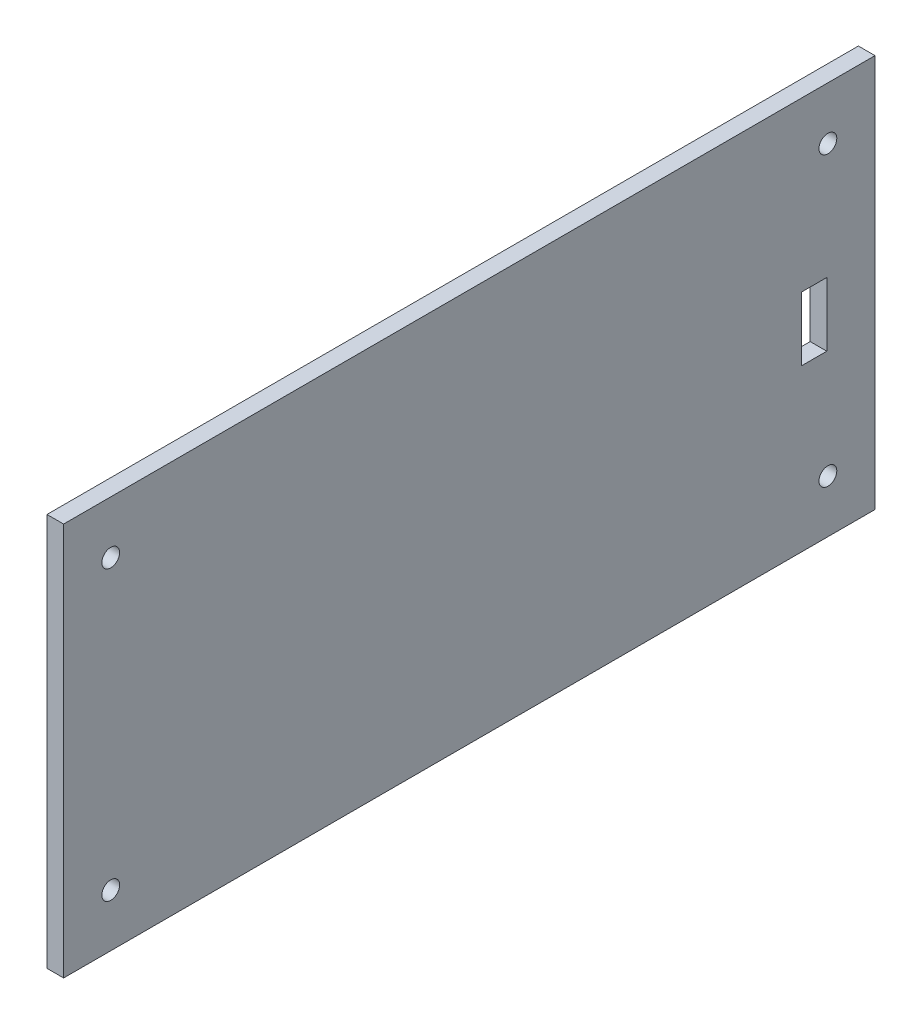
ISO-10303-21;
HEADER;
FILE_DESCRIPTION(('STEP AP214'),'2;1');
FILE_NAME('part.step','',(''),(''),'','','');
FILE_SCHEMA(('AUTOMOTIVE_DESIGN { 1 0 10303 214 1 1 1 1 }'));
ENDSEC;
DATA;
#1=APPLICATION_CONTEXT('core data for automotive mechanical design processes');
#2=APPLICATION_PROTOCOL_DEFINITION('international standard','automotive_design',2000,#1);
#3=PRODUCT_CONTEXT('',#1,'mechanical');
#4=PRODUCT('Part','Part','',(#3));
#5=PRODUCT_RELATED_PRODUCT_CATEGORY('part','',(#4));
#6=PRODUCT_DEFINITION_FORMATION('','',#4);
#7=PRODUCT_DEFINITION_CONTEXT('part definition',#1,'design');
#8=PRODUCT_DEFINITION('design','',#6,#7);
#9=PRODUCT_DEFINITION_SHAPE('','',#8);
#10=(LENGTH_UNIT() NAMED_UNIT(*) SI_UNIT(.MILLI.,.METRE.));
#11=(NAMED_UNIT(*) PLANE_ANGLE_UNIT() SI_UNIT($,.RADIAN.));
#12=(NAMED_UNIT(*) SI_UNIT($,.STERADIAN.) SOLID_ANGLE_UNIT());
#13=UNCERTAINTY_MEASURE_WITH_UNIT(LENGTH_MEASURE(1.E-05),#10,'distance_accuracy_value','');
#14=(GEOMETRIC_REPRESENTATION_CONTEXT(3) GLOBAL_UNCERTAINTY_ASSIGNED_CONTEXT((#13)) GLOBAL_UNIT_ASSIGNED_CONTEXT((#10,
#11,#12)) REPRESENTATION_CONTEXT('',''));
#15=CARTESIAN_POINT('',(0.,0.,0.));
#16=DIRECTION('',(0.,0.,1.));
#17=DIRECTION('',(1.,0.,0.));
#18=AXIS2_PLACEMENT_3D('',#15,#16,#17);
#19=CARTESIAN_POINT('',(3.175,0.,0.));
#20=DIRECTION('',(-1.,0.,0.));
#21=DIRECTION('',(0.,0.,1.));
#22=AXIS2_PLACEMENT_3D('',#19,#20,#21);
#23=PLANE('',#22);
#24=CARTESIAN_POINT('',(3.175,65.05,-9.00000000000001));
#25=DIRECTION('',(1.,0.,0.));
#26=DIRECTION('',(0.,0.,-1.));
#27=AXIS2_PLACEMENT_3D('',#24,#25,#26);
#28=CIRCLE('',#27,1.7);
#29=CARTESIAN_POINT('',(3.175,65.05,-10.7));
#30=VERTEX_POINT('',#29);
#31=EDGE_CURVE('E156',#30,#30,#28,.T.);
#32=ORIENTED_EDGE('',*,*,#31,.F.);
#33=EDGE_LOOP('',(#32));
#34=FACE_BOUND('',#33,.T.);
#35=CARTESIAN_POINT('',(3.175,65.05,-146.));
#36=DIRECTION('',(1.,0.,0.));
#37=DIRECTION('',(0.,0.,-1.));
#38=AXIS2_PLACEMENT_3D('',#35,#36,#37);
#39=CIRCLE('',#38,1.70000000000001);
#40=CARTESIAN_POINT('',(3.175,65.05,-147.7));
#41=VERTEX_POINT('',#40);
#42=EDGE_CURVE('E164',#41,#41,#39,.T.);
#43=ORIENTED_EDGE('',*,*,#42,.F.);
#44=EDGE_LOOP('',(#43));
#45=FACE_BOUND('',#44,.T.);
#46=CARTESIAN_POINT('',(3.175,10.05,-146.));
#47=DIRECTION('',(1.,0.,0.));
#48=DIRECTION('',(0.,0.,-1.));
#49=AXIS2_PLACEMENT_3D('',#46,#47,#48);
#50=CIRCLE('',#49,1.70000000000001);
#51=CARTESIAN_POINT('',(3.175,10.05,-147.7));
#52=VERTEX_POINT('',#51);
#53=EDGE_CURVE('E172',#52,#52,#50,.T.);
#54=ORIENTED_EDGE('',*,*,#53,.F.);
#55=EDGE_LOOP('',(#54));
#56=FACE_BOUND('',#55,.T.);
#57=CARTESIAN_POINT('',(3.175,10.05,-9.00000000000001));
#58=DIRECTION('',(1.,0.,0.));
#59=DIRECTION('',(0.,0.,-1.));
#60=AXIS2_PLACEMENT_3D('',#57,#58,#59);
#61=CIRCLE('',#60,1.7);
#62=CARTESIAN_POINT('',(3.175,10.05,-10.7));
#63=VERTEX_POINT('',#62);
#64=EDGE_CURVE('E180',#63,#63,#61,.T.);
#65=ORIENTED_EDGE('',*,*,#64,.F.);
#66=EDGE_LOOP('',(#65));
#67=FACE_BOUND('',#66,.T.);
#68=DIRECTION('',(0.,-1.,0.));
#69=VECTOR('',#68,1.);
#70=CARTESIAN_POINT('',(3.175,0.,0.));
#71=LINE('',#70,#69);
#72=CARTESIAN_POINT('',(3.175,75.1,0.));
#73=VERTEX_POINT('',#72);
#74=CARTESIAN_POINT('',(3.175,0.,0.));
#75=VERTEX_POINT('',#74);
#76=EDGE_CURVE('E188',#73,#75,#71,.T.);
#77=ORIENTED_EDGE('',*,*,#76,.T.);
#78=DIRECTION('',(0.,0.,-1.));
#79=VECTOR('',#78,1.);
#80=CARTESIAN_POINT('',(3.175,0.,0.));
#81=LINE('',#80,#79);
#82=CARTESIAN_POINT('',(3.175,0.,-155.));
#83=VERTEX_POINT('',#82);
#84=EDGE_CURVE('E192',#75,#83,#81,.T.);
#85=ORIENTED_EDGE('',*,*,#84,.T.);
#86=DIRECTION('',(0.,1.,0.));
#87=VECTOR('',#86,1.);
#88=CARTESIAN_POINT('',(3.175,0.,-155.));
#89=LINE('',#88,#87);
#90=CARTESIAN_POINT('',(3.175,75.1,-155.));
#91=VERTEX_POINT('',#90);
#92=EDGE_CURVE('E196',#83,#91,#89,.T.);
#93=ORIENTED_EDGE('',*,*,#92,.T.);
#94=DIRECTION('',(0.,0.,1.));
#95=VECTOR('',#94,1.);
#96=CARTESIAN_POINT('',(3.175,75.1,0.));
#97=LINE('',#96,#95);
#98=EDGE_CURVE('E199',#91,#73,#97,.T.);
#99=ORIENTED_EDGE('',*,*,#98,.T.);
#100=EDGE_LOOP('',(#77,#85,#93,#99));
#101=FACE_BOUND('',#100,.T.);
#102=DIRECTION('',(0.,-1.,0.));
#103=VECTOR('',#102,1.);
#104=CARTESIAN_POINT('',(3.175,30.8,-140.991666666667));
#105=LINE('',#104,#103);
#106=CARTESIAN_POINT('',(3.175,43.,-140.991666666667));
#107=VERTEX_POINT('',#106);
#108=CARTESIAN_POINT('',(3.175,30.8,-140.991666666667));
#109=VERTEX_POINT('',#108);
#110=EDGE_CURVE('E108',#107,#109,#105,.T.);
#111=ORIENTED_EDGE('',*,*,#110,.F.);
#112=DIRECTION('',(0.,0.,1.));
#113=VECTOR('',#112,1.);
#114=CARTESIAN_POINT('',(3.175,43.,-140.991666666667));
#115=LINE('',#114,#113);
#116=CARTESIAN_POINT('',(3.175,43.,-145.791666666667));
#117=VERTEX_POINT('',#116);
#118=EDGE_CURVE('E134',#117,#107,#115,.T.);
#119=ORIENTED_EDGE('',*,*,#118,.F.);
#120=DIRECTION('',(0.,1.,0.));
#121=VECTOR('',#120,1.);
#122=CARTESIAN_POINT('',(3.175,30.8,-145.791666666667));
#123=LINE('',#122,#121);
#124=CARTESIAN_POINT('',(3.175,30.8,-145.791666666667));
#125=VERTEX_POINT('',#124);
#126=EDGE_CURVE('E130',#125,#117,#123,.T.);
#127=ORIENTED_EDGE('',*,*,#126,.F.);
#128=DIRECTION('',(0.,0.,-1.));
#129=VECTOR('',#128,1.);
#130=CARTESIAN_POINT('',(3.175,30.8,-140.991666666667));
#131=LINE('',#130,#129);
#132=EDGE_CURVE('E117',#109,#125,#131,.T.);
#133=ORIENTED_EDGE('',*,*,#132,.F.);
#134=EDGE_LOOP('',(#111,#119,#127,#133));
#135=FACE_BOUND('',#134,.T.);
#136=ADVANCED_FACE('F42',(#34,#45,#56,#67,#101,#135),#23,.F.);
#137=CARTESIAN_POINT('',(0.,0.,0.));
#138=DIRECTION('',(-1.,0.,0.));
#139=DIRECTION('',(0.,0.,1.));
#140=AXIS2_PLACEMENT_3D('',#137,#138,#139);
#141=PLANE('',#140);
#142=CARTESIAN_POINT('',(0.,65.05,-146.));
#143=DIRECTION('',(1.,0.,0.));
#144=DIRECTION('',(0.,0.,-1.));
#145=AXIS2_PLACEMENT_3D('',#142,#143,#144);
#146=CIRCLE('',#145,1.70000000000001);
#147=CARTESIAN_POINT('',(0.,65.05,-147.7));
#148=VERTEX_POINT('',#147);
#149=EDGE_CURVE('E160',#148,#148,#146,.T.);
#150=ORIENTED_EDGE('',*,*,#149,.T.);
#151=EDGE_LOOP('',(#150));
#152=FACE_BOUND('',#151,.T.);
#153=CARTESIAN_POINT('',(0.,10.05,-9.00000000000001));
#154=DIRECTION('',(1.,0.,0.));
#155=DIRECTION('',(0.,0.,-1.));
#156=AXIS2_PLACEMENT_3D('',#153,#154,#155);
#157=CIRCLE('',#156,1.7);
#158=CARTESIAN_POINT('',(0.,10.05,-10.7));
#159=VERTEX_POINT('',#158);
#160=EDGE_CURVE('E176',#159,#159,#157,.T.);
#161=ORIENTED_EDGE('',*,*,#160,.T.);
#162=EDGE_LOOP('',(#161));
#163=FACE_BOUND('',#162,.T.);
#164=DIRECTION('',(0.,-1.,0.));
#165=VECTOR('',#164,1.);
#166=CARTESIAN_POINT('',(0.,0.,0.));
#167=LINE('',#166,#165);
#168=CARTESIAN_POINT('',(0.,75.1,0.));
#169=VERTEX_POINT('',#168);
#170=CARTESIAN_POINT('',(0.,0.,0.));
#171=VERTEX_POINT('',#170);
#172=EDGE_CURVE('E184',#169,#171,#167,.T.);
#173=ORIENTED_EDGE('',*,*,#172,.F.);
#174=DIRECTION('',(0.,0.,1.));
#175=VECTOR('',#174,1.);
#176=CARTESIAN_POINT('',(0.,75.1,0.));
#177=LINE('',#176,#175);
#178=CARTESIAN_POINT('',(0.,75.1,-155.));
#179=VERTEX_POINT('',#178);
#180=EDGE_CURVE('E193',#179,#169,#177,.T.);
#181=ORIENTED_EDGE('',*,*,#180,.F.);
#182=DIRECTION('',(0.,1.,0.));
#183=VECTOR('',#182,1.);
#184=CARTESIAN_POINT('',(0.,0.,-155.));
#185=LINE('',#184,#183);
#186=CARTESIAN_POINT('',(0.,0.,-155.));
#187=VERTEX_POINT('',#186);
#188=EDGE_CURVE('E209',#187,#179,#185,.T.);
#189=ORIENTED_EDGE('',*,*,#188,.F.);
#190=DIRECTION('',(0.,0.,-1.));
#191=VECTOR('',#190,1.);
#192=CARTESIAN_POINT('',(0.,0.,0.));
#193=LINE('',#192,#191);
#194=EDGE_CURVE('E206',#171,#187,#193,.T.);
#195=ORIENTED_EDGE('',*,*,#194,.F.);
#196=EDGE_LOOP('',(#173,#181,#189,#195));
#197=FACE_BOUND('',#196,.T.);
#198=CARTESIAN_POINT('',(0.,10.05,-146.));
#199=DIRECTION('',(1.,0.,0.));
#200=DIRECTION('',(0.,0.,-1.));
#201=AXIS2_PLACEMENT_3D('',#198,#199,#200);
#202=CIRCLE('',#201,1.70000000000001);
#203=CARTESIAN_POINT('',(0.,10.05,-147.7));
#204=VERTEX_POINT('',#203);
#205=EDGE_CURVE('E168',#204,#204,#202,.T.);
#206=ORIENTED_EDGE('',*,*,#205,.T.);
#207=EDGE_LOOP('',(#206));
#208=FACE_BOUND('',#207,.T.);
#209=CARTESIAN_POINT('',(0.,65.05,-9.00000000000001));
#210=DIRECTION('',(1.,0.,0.));
#211=DIRECTION('',(0.,0.,-1.));
#212=AXIS2_PLACEMENT_3D('',#209,#210,#211);
#213=CIRCLE('',#212,1.7);
#214=CARTESIAN_POINT('',(0.,65.05,-10.7));
#215=VERTEX_POINT('',#214);
#216=EDGE_CURVE('E126',#215,#215,#213,.T.);
#217=ORIENTED_EDGE('',*,*,#216,.T.);
#218=EDGE_LOOP('',(#217));
#219=FACE_BOUND('',#218,.T.);
#220=DIRECTION('',(0.,0.,1.));
#221=VECTOR('',#220,1.);
#222=CARTESIAN_POINT('',(0.,43.,-140.991666666667));
#223=LINE('',#222,#221);
#224=CARTESIAN_POINT('',(0.,43.,-145.791666666667));
#225=VERTEX_POINT('',#224);
#226=CARTESIAN_POINT('',(0.,43.,-140.991666666667));
#227=VERTEX_POINT('',#226);
#228=EDGE_CURVE('E118',#225,#227,#223,.T.);
#229=ORIENTED_EDGE('',*,*,#228,.T.);
#230=DIRECTION('',(0.,-1.,0.));
#231=VECTOR('',#230,1.);
#232=CARTESIAN_POINT('',(0.,30.8,-140.991666666667));
#233=LINE('',#232,#231);
#234=CARTESIAN_POINT('',(0.,30.8,-140.991666666667));
#235=VERTEX_POINT('',#234);
#236=EDGE_CURVE('E66',#227,#235,#233,.T.);
#237=ORIENTED_EDGE('',*,*,#236,.T.);
#238=DIRECTION('',(0.,0.,-1.));
#239=VECTOR('',#238,1.);
#240=CARTESIAN_POINT('',(0.,30.8,-140.991666666667));
#241=LINE('',#240,#239);
#242=CARTESIAN_POINT('',(0.,30.8,-145.791666666667));
#243=VERTEX_POINT('',#242);
#244=EDGE_CURVE('E124',#235,#243,#241,.T.);
#245=ORIENTED_EDGE('',*,*,#244,.T.);
#246=DIRECTION('',(0.,1.,0.));
#247=VECTOR('',#246,1.);
#248=CARTESIAN_POINT('',(0.,30.8,-145.791666666667));
#249=LINE('',#248,#247);
#250=EDGE_CURVE('E143',#243,#225,#249,.T.);
#251=ORIENTED_EDGE('',*,*,#250,.T.);
#252=EDGE_LOOP('',(#229,#237,#245,#251));
#253=FACE_BOUND('',#252,.T.);
#254=ADVANCED_FACE('F232',(#152,#163,#197,#208,#219,#253),#141,.T.);
#255=CARTESIAN_POINT('',(3.175,0.,0.));
#256=DIRECTION('',(0.,0.,-1.));
#257=DIRECTION('',(-1.,0.,0.));
#258=AXIS2_PLACEMENT_3D('',#255,#256,#257);
#259=PLANE('',#258);
#260=ORIENTED_EDGE('',*,*,#172,.T.);
#261=DIRECTION('',(-1.,0.,0.));
#262=VECTOR('',#261,1.);
#263=CARTESIAN_POINT('',(3.175,0.,0.));
#264=LINE('',#263,#262);
#265=EDGE_CURVE('E11',#75,#171,#264,.T.);
#266=ORIENTED_EDGE('',*,*,#265,.F.);
#267=ORIENTED_EDGE('',*,*,#76,.F.);
#268=DIRECTION('',(-1.,0.,0.));
#269=VECTOR('',#268,1.);
#270=CARTESIAN_POINT('',(3.175,75.1,0.));
#271=LINE('',#270,#269);
#272=EDGE_CURVE('E202',#73,#169,#271,.T.);
#273=ORIENTED_EDGE('',*,*,#272,.T.);
#274=EDGE_LOOP('',(#260,#266,#267,#273));
#275=FACE_BOUND('',#274,.T.);
#276=ADVANCED_FACE('F44',(#275),#259,.F.);
#277=CARTESIAN_POINT('',(3.175,0.,0.));
#278=DIRECTION('',(0.,1.,0.));
#279=DIRECTION('',(0.,0.,1.));
#280=AXIS2_PLACEMENT_3D('',#277,#278,#279);
#281=PLANE('',#280);
#282=ORIENTED_EDGE('',*,*,#194,.T.);
#283=DIRECTION('',(-1.,0.,0.));
#284=VECTOR('',#283,1.);
#285=CARTESIAN_POINT('',(3.175,0.,-155.));
#286=LINE('',#285,#284);
#287=EDGE_CURVE('E51',#83,#187,#286,.T.);
#288=ORIENTED_EDGE('',*,*,#287,.F.);
#289=ORIENTED_EDGE('',*,*,#84,.F.);
#290=ORIENTED_EDGE('',*,*,#265,.T.);
#291=EDGE_LOOP('',(#282,#288,#289,#290));
#292=FACE_BOUND('',#291,.T.);
#293=ADVANCED_FACE('F242',(#292),#281,.F.);
#294=CARTESIAN_POINT('',(3.175,0.,-155.));
#295=DIRECTION('',(0.,0.,1.));
#296=DIRECTION('',(1.,0.,0.));
#297=AXIS2_PLACEMENT_3D('',#294,#295,#296);
#298=PLANE('',#297);
#299=ORIENTED_EDGE('',*,*,#188,.T.);
#300=DIRECTION('',(-1.,0.,0.));
#301=VECTOR('',#300,1.);
#302=CARTESIAN_POINT('',(3.175,75.1,-155.));
#303=LINE('',#302,#301);
#304=EDGE_CURVE('E217',#91,#179,#303,.T.);
#305=ORIENTED_EDGE('',*,*,#304,.F.);
#306=ORIENTED_EDGE('',*,*,#92,.F.);
#307=ORIENTED_EDGE('',*,*,#287,.T.);
#308=EDGE_LOOP('',(#299,#305,#306,#307));
#309=FACE_BOUND('',#308,.T.);
#310=ADVANCED_FACE('F226',(#309),#298,.F.);
#311=CARTESIAN_POINT('',(3.175,75.1,0.));
#312=DIRECTION('',(0.,-1.,0.));
#313=DIRECTION('',(0.,0.,-1.));
#314=AXIS2_PLACEMENT_3D('',#311,#312,#313);
#315=PLANE('',#314);
#316=ORIENTED_EDGE('',*,*,#180,.T.);
#317=ORIENTED_EDGE('',*,*,#272,.F.);
#318=ORIENTED_EDGE('',*,*,#98,.F.);
#319=ORIENTED_EDGE('',*,*,#304,.T.);
#320=EDGE_LOOP('',(#316,#317,#318,#319));
#321=FACE_BOUND('',#320,.T.);
#322=ADVANCED_FACE('F236',(#321),#315,.F.);
#323=CARTESIAN_POINT('',(3.175,10.05,-9.00000000000001));
#324=DIRECTION('',(-1.,0.,0.));
#325=DIRECTION('',(0.,0.,1.));
#326=AXIS2_PLACEMENT_3D('',#323,#324,#325);
#327=CYLINDRICAL_SURFACE('',#326,1.7);
#328=ORIENTED_EDGE('',*,*,#64,.T.);
#329=EDGE_LOOP('',(#328));
#330=FACE_BOUND('',#329,.T.);
#331=ORIENTED_EDGE('',*,*,#160,.F.);
#332=EDGE_LOOP('',(#331));
#333=FACE_BOUND('',#332,.T.);
#334=ADVANCED_FACE('F260',(#330,#333),#327,.F.);
#335=CARTESIAN_POINT('',(3.175,10.05,-146.));
#336=DIRECTION('',(-1.,0.,0.));
#337=DIRECTION('',(0.,0.,1.));
#338=AXIS2_PLACEMENT_3D('',#335,#336,#337);
#339=CYLINDRICAL_SURFACE('',#338,1.70000000000001);
#340=ORIENTED_EDGE('',*,*,#53,.T.);
#341=EDGE_LOOP('',(#340));
#342=FACE_BOUND('',#341,.T.);
#343=ORIENTED_EDGE('',*,*,#205,.F.);
#344=EDGE_LOOP('',(#343));
#345=FACE_BOUND('',#344,.T.);
#346=ADVANCED_FACE('F267',(#342,#345),#339,.F.);
#347=CARTESIAN_POINT('',(3.175,65.05,-146.));
#348=DIRECTION('',(-1.,0.,0.));
#349=DIRECTION('',(0.,0.,1.));
#350=AXIS2_PLACEMENT_3D('',#347,#348,#349);
#351=CYLINDRICAL_SURFACE('',#350,1.70000000000001);
#352=ORIENTED_EDGE('',*,*,#42,.T.);
#353=EDGE_LOOP('',(#352));
#354=FACE_BOUND('',#353,.T.);
#355=ORIENTED_EDGE('',*,*,#149,.F.);
#356=EDGE_LOOP('',(#355));
#357=FACE_BOUND('',#356,.T.);
#358=ADVANCED_FACE('F272',(#354,#357),#351,.F.);
#359=CARTESIAN_POINT('',(3.175,65.05,-9.00000000000001));
#360=DIRECTION('',(-1.,0.,0.));
#361=DIRECTION('',(0.,0.,1.));
#362=AXIS2_PLACEMENT_3D('',#359,#360,#361);
#363=CYLINDRICAL_SURFACE('',#362,1.7);
#364=ORIENTED_EDGE('',*,*,#31,.T.);
#365=EDGE_LOOP('',(#364));
#366=FACE_BOUND('',#365,.T.);
#367=ORIENTED_EDGE('',*,*,#216,.F.);
#368=EDGE_LOOP('',(#367));
#369=FACE_BOUND('',#368,.T.);
#370=ADVANCED_FACE('F282',(#366,#369),#363,.F.);
#371=CARTESIAN_POINT('',(3.175,30.8,-140.991666666667));
#372=DIRECTION('',(0.,0.,-1.));
#373=DIRECTION('',(-1.,0.,0.));
#374=AXIS2_PLACEMENT_3D('',#371,#372,#373);
#375=PLANE('',#374);
#376=ORIENTED_EDGE('',*,*,#236,.F.);
#377=DIRECTION('',(-1.,0.,0.));
#378=VECTOR('',#377,1.);
#379=CARTESIAN_POINT('',(3.175,43.,-140.991666666667));
#380=LINE('',#379,#378);
#381=EDGE_CURVE('E112',#107,#227,#380,.T.);
#382=ORIENTED_EDGE('',*,*,#381,.F.);
#383=ORIENTED_EDGE('',*,*,#110,.T.);
#384=DIRECTION('',(-1.,0.,0.));
#385=VECTOR('',#384,1.);
#386=CARTESIAN_POINT('',(3.175,30.8,-140.991666666667));
#387=LINE('',#386,#385);
#388=EDGE_CURVE('E111',#109,#235,#387,.T.);
#389=ORIENTED_EDGE('',*,*,#388,.T.);
#390=EDGE_LOOP('',(#376,#382,#383,#389));
#391=FACE_BOUND('',#390,.T.);
#392=ADVANCED_FACE('F110',(#391),#375,.T.);
#393=CARTESIAN_POINT('',(3.175,30.8,-140.991666666667));
#394=DIRECTION('',(0.,1.,0.));
#395=DIRECTION('',(0.,0.,1.));
#396=AXIS2_PLACEMENT_3D('',#393,#394,#395);
#397=PLANE('',#396);
#398=ORIENTED_EDGE('',*,*,#244,.F.);
#399=ORIENTED_EDGE('',*,*,#388,.F.);
#400=ORIENTED_EDGE('',*,*,#132,.T.);
#401=DIRECTION('',(-1.,0.,0.));
#402=VECTOR('',#401,1.);
#403=CARTESIAN_POINT('',(3.175,30.8,-145.791666666667));
#404=LINE('',#403,#402);
#405=EDGE_CURVE('E127',#125,#243,#404,.T.);
#406=ORIENTED_EDGE('',*,*,#405,.T.);
#407=EDGE_LOOP('',(#398,#399,#400,#406));
#408=FACE_BOUND('',#407,.T.);
#409=ADVANCED_FACE('F121',(#408),#397,.T.);
#410=CARTESIAN_POINT('',(3.175,30.8,-145.791666666667));
#411=DIRECTION('',(0.,0.,1.));
#412=DIRECTION('',(1.,0.,0.));
#413=AXIS2_PLACEMENT_3D('',#410,#411,#412);
#414=PLANE('',#413);
#415=ORIENTED_EDGE('',*,*,#250,.F.);
#416=ORIENTED_EDGE('',*,*,#405,.F.);
#417=ORIENTED_EDGE('',*,*,#126,.T.);
#418=DIRECTION('',(-1.,0.,0.));
#419=VECTOR('',#418,1.);
#420=CARTESIAN_POINT('',(3.175,43.,-145.791666666667));
#421=LINE('',#420,#419);
#422=EDGE_CURVE('E58',#117,#225,#421,.T.);
#423=ORIENTED_EDGE('',*,*,#422,.T.);
#424=EDGE_LOOP('',(#415,#416,#417,#423));
#425=FACE_BOUND('',#424,.T.);
#426=ADVANCED_FACE('F294',(#425),#414,.T.);
#427=CARTESIAN_POINT('',(3.175,43.,-140.991666666667));
#428=DIRECTION('',(0.,-1.,0.));
#429=DIRECTION('',(0.,0.,-1.));
#430=AXIS2_PLACEMENT_3D('',#427,#428,#429);
#431=PLANE('',#430);
#432=ORIENTED_EDGE('',*,*,#228,.F.);
#433=ORIENTED_EDGE('',*,*,#422,.F.);
#434=ORIENTED_EDGE('',*,*,#118,.T.);
#435=ORIENTED_EDGE('',*,*,#381,.T.);
#436=EDGE_LOOP('',(#432,#433,#434,#435));
#437=FACE_BOUND('',#436,.T.);
#438=ADVANCED_FACE('F297',(#437),#431,.T.);
#439=CLOSED_SHELL('',(#136,#254,#276,#293,#310,#322,#334,#346,#358,#370,#392,#409,#426,#438));
#440=MANIFOLD_SOLID_BREP('B2',#439);
#441=ADVANCED_BREP_SHAPE_REPRESENTATION('',(#18,#440),#14);
#442=SHAPE_DEFINITION_REPRESENTATION(#9,#441);
ENDSEC;
END-ISO-10303-21;
